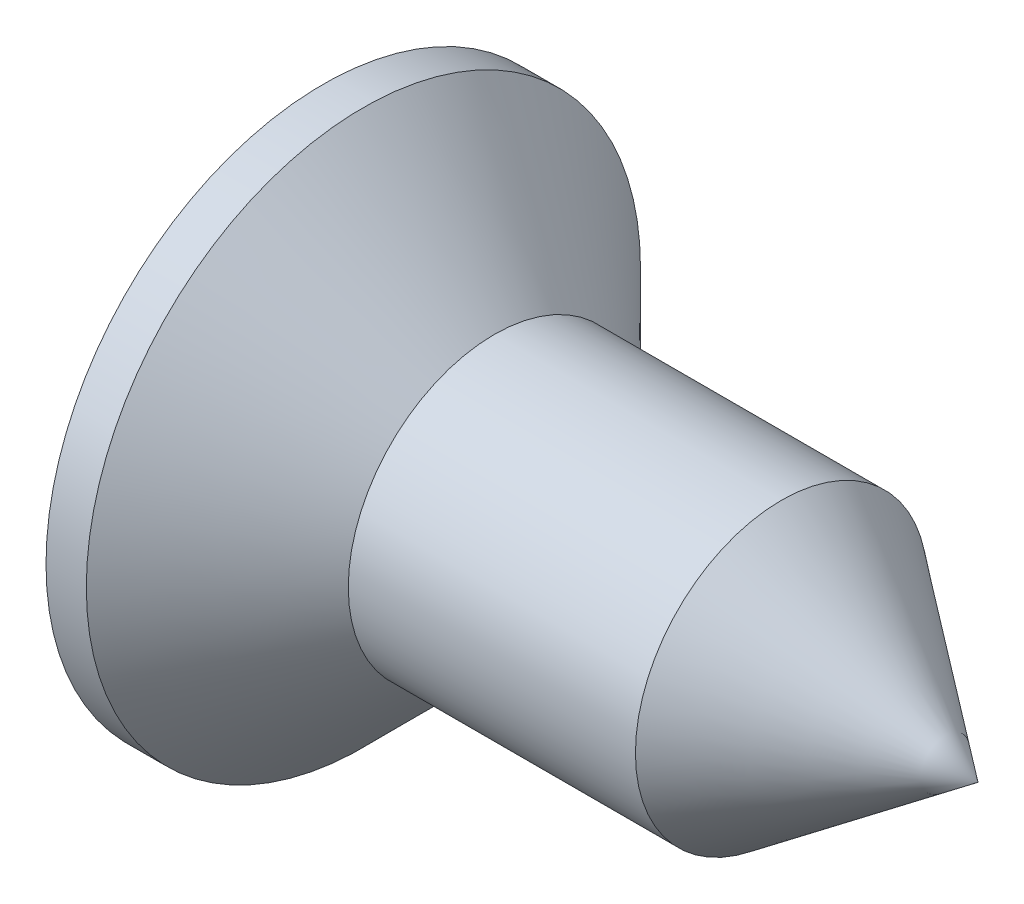
ISO-10303-21;
HEADER;
FILE_DESCRIPTION(('STEP AP214'),'2;1');
FILE_NAME('part.step','',(''),(''),'','','');
FILE_SCHEMA(('AUTOMOTIVE_DESIGN { 1 0 10303 214 1 1 1 1 }'));
ENDSEC;
DATA;
#1=APPLICATION_CONTEXT('core data for automotive mechanical design processes');
#2=APPLICATION_PROTOCOL_DEFINITION('international standard','automotive_design',2000,#1);
#3=PRODUCT_CONTEXT('',#1,'mechanical');
#4=PRODUCT('Part','Part','',(#3));
#5=PRODUCT_RELATED_PRODUCT_CATEGORY('part','',(#4));
#6=PRODUCT_DEFINITION_FORMATION('','',#4);
#7=PRODUCT_DEFINITION_CONTEXT('part definition',#1,'design');
#8=PRODUCT_DEFINITION('design','',#6,#7);
#9=PRODUCT_DEFINITION_SHAPE('','',#8);
#10=(LENGTH_UNIT() NAMED_UNIT(*) SI_UNIT(.MILLI.,.METRE.));
#11=(NAMED_UNIT(*) PLANE_ANGLE_UNIT() SI_UNIT($,.RADIAN.));
#12=(NAMED_UNIT(*) SI_UNIT($,.STERADIAN.) SOLID_ANGLE_UNIT());
#13=UNCERTAINTY_MEASURE_WITH_UNIT(LENGTH_MEASURE(1.E-05),#10,'distance_accuracy_value','');
#14=(GEOMETRIC_REPRESENTATION_CONTEXT(3) GLOBAL_UNCERTAINTY_ASSIGNED_CONTEXT((#13)) GLOBAL_UNIT_ASSIGNED_CONTEXT((#10,
#11,#12)) REPRESENTATION_CONTEXT('',''));
#15=CARTESIAN_POINT('',(0.,0.,0.));
#16=DIRECTION('',(0.,0.,1.));
#17=DIRECTION('',(1.,0.,0.));
#18=AXIS2_PLACEMENT_3D('',#15,#16,#17);
#19=CARTESIAN_POINT('',(0.,0.4,0.4));
#20=DIRECTION('',(-0.139173100960066,-0.99026806874157,0.));
#21=DIRECTION('',(0.99026806874157,-0.139173100960066,0.));
#22=AXIS2_PLACEMENT_3D('',#19,#20,#21);
#23=PLANE('',#22);
#24=DIRECTION('',(-0.980814848463989,0.137844537491629,0.137844537491629));
#25=VECTOR('',#24,1.);
#26=CARTESIAN_POINT('',(1.5,0.189188747946412,0.369438720315922));
#27=LINE('',#26,#25);
#28=CARTESIAN_POINT('',(1.5,0.189188747946412,0.369438720315922));
#29=VERTEX_POINT('',#28);
#30=CARTESIAN_POINT('',(0.,0.400000000000001,0.58024997236951));
#31=VERTEX_POINT('',#30);
#32=EDGE_CURVE('E374',#29,#31,#27,.T.);
#33=ORIENTED_EDGE('',*,*,#32,.F.);
#34=DIRECTION('',(0.,0.,1.));
#35=VECTOR('',#34,1.);
#36=CARTESIAN_POINT('',(1.5,0.189188747946412,0.4));
#37=LINE('',#36,#35);
#38=CARTESIAN_POINT('',(1.5,0.189188747946412,0.549688692685432));
#39=VERTEX_POINT('',#38);
#40=EDGE_CURVE('E214',#39,#29,#37,.F.);
#41=ORIENTED_EDGE('',*,*,#40,.F.);
#42=DIRECTION('',(-0.813777054443472,0.114368906493139,0.569812827943414));
#43=VECTOR('',#42,1.);
#44=CARTESIAN_POINT('',(0.,0.400000000000001,1.6));
#45=LINE('',#44,#43);
#46=CARTESIAN_POINT('',(0.,0.400000000000001,1.6));
#47=VERTEX_POINT('',#46);
#48=EDGE_CURVE('E209',#39,#47,#45,.T.);
#49=ORIENTED_EDGE('',*,*,#48,.T.);
#50=DIRECTION('',(0.,0.,-1.));
#51=VECTOR('',#50,1.);
#52=CARTESIAN_POINT('',(0.,0.4,0.4));
#53=LINE('',#52,#51);
#54=EDGE_CURVE('E294',#47,#31,#53,.T.);
#55=ORIENTED_EDGE('',*,*,#54,.T.);
#56=EDGE_LOOP('',(#33,#41,#49,#55));
#57=FACE_BOUND('',#56,.T.);
#58=ADVANCED_FACE('F90',(#57),#23,.T.);
#59=CARTESIAN_POINT('',(0.,-0.4,0.4));
#60=DIRECTION('',(-0.139173100960066,0.99026806874157,0.));
#61=DIRECTION('',(-0.99026806874157,-0.139173100960066,0.));
#62=AXIS2_PLACEMENT_3D('',#59,#60,#61);
#63=PLANE('',#62);
#64=DIRECTION('',(-0.980814848463989,-0.137844537491629,0.137844537491629));
#65=VECTOR('',#64,1.);
#66=CARTESIAN_POINT('',(0.75,-0.294594373973206,0.474844346342716));
#67=LINE('',#66,#65);
#68=CARTESIAN_POINT('',(1.5,-0.189188747946412,0.369438720315922));
#69=VERTEX_POINT('',#68);
#70=CARTESIAN_POINT('',(0.,-0.4,0.58024997236951));
#71=VERTEX_POINT('',#70);
#72=EDGE_CURVE('E462',#69,#71,#67,.T.);
#73=ORIENTED_EDGE('',*,*,#72,.T.);
#74=DIRECTION('',(0.,0.,1.));
#75=VECTOR('',#74,1.);
#76=CARTESIAN_POINT('',(0.,-0.4,0.4));
#77=LINE('',#76,#75);
#78=CARTESIAN_POINT('',(0.,-0.399999999999999,1.6));
#79=VERTEX_POINT('',#78);
#80=EDGE_CURVE('E205',#71,#79,#77,.T.);
#81=ORIENTED_EDGE('',*,*,#80,.T.);
#82=DIRECTION('',(-0.813777054443472,-0.114368906493139,0.569812827943414));
#83=VECTOR('',#82,1.);
#84=CARTESIAN_POINT('',(0.556440725649475,-0.321797355954818,1.21037600933336));
#85=LINE('',#84,#83);
#86=CARTESIAN_POINT('',(1.5,-0.189188747946412,0.549688692685432));
#87=VERTEX_POINT('',#86);
#88=EDGE_CURVE('E201',#87,#79,#85,.T.);
#89=ORIENTED_EDGE('',*,*,#88,.F.);
#90=DIRECTION('',(0.,0.,-1.));
#91=VECTOR('',#90,1.);
#92=CARTESIAN_POINT('',(1.5,-0.189188747946413,0.4));
#93=LINE('',#92,#91);
#94=EDGE_CURVE('E185',#69,#87,#93,.F.);
#95=ORIENTED_EDGE('',*,*,#94,.F.);
#96=EDGE_LOOP('',(#73,#81,#89,#95));
#97=FACE_BOUND('',#96,.T.);
#98=ADVANCED_FACE('F202',(#97),#63,.T.);
#99=CARTESIAN_POINT('',(0.,-0.4,0.4));
#100=DIRECTION('',(-0.139173100960066,0.,-0.99026806874157));
#101=DIRECTION('',(-0.99026806874157,0.,0.139173100960066));
#102=AXIS2_PLACEMENT_3D('',#99,#100,#101);
#103=PLANE('',#102);
#104=DIRECTION('',(-0.980814848463989,-0.137844537491629,0.137844537491629));
#105=VECTOR('',#104,1.);
#106=CARTESIAN_POINT('',(1.5,-0.369438720315922,0.189188747946412));
#107=LINE('',#106,#105);
#108=CARTESIAN_POINT('',(1.5,-0.369438720315922,0.189188747946413));
#109=VERTEX_POINT('',#108);
#110=CARTESIAN_POINT('',(0.,-0.58024997236951,0.4));
#111=VERTEX_POINT('',#110);
#112=EDGE_CURVE('E464',#109,#111,#107,.T.);
#113=ORIENTED_EDGE('',*,*,#112,.F.);
#114=DIRECTION('',(0.,-1.,0.));
#115=VECTOR('',#114,1.);
#116=CARTESIAN_POINT('',(1.5,-0.4,0.189188747946413));
#117=LINE('',#116,#115);
#118=CARTESIAN_POINT('',(1.5,-0.549688692685432,0.189188747946413));
#119=VERTEX_POINT('',#118);
#120=EDGE_CURVE('E197',#119,#109,#117,.F.);
#121=ORIENTED_EDGE('',*,*,#120,.F.);
#122=DIRECTION('',(-0.813777054443471,-0.569812827943414,0.114368906493139));
#123=VECTOR('',#122,1.);
#124=CARTESIAN_POINT('',(0.0744566334767262,-1.54786490396988,0.389535802582051));
#125=LINE('',#124,#123);
#126=CARTESIAN_POINT('',(0.,-1.6,0.4));
#127=VERTEX_POINT('',#126);
#128=EDGE_CURVE('E179',#119,#127,#125,.T.);
#129=ORIENTED_EDGE('',*,*,#128,.T.);
#130=DIRECTION('',(0.,1.,0.));
#131=VECTOR('',#130,1.);
#132=CARTESIAN_POINT('',(0.,-0.4,0.4));
#133=LINE('',#132,#131);
#134=EDGE_CURVE('E283',#127,#111,#133,.T.);
#135=ORIENTED_EDGE('',*,*,#134,.T.);
#136=EDGE_LOOP('',(#113,#121,#129,#135));
#137=FACE_BOUND('',#136,.T.);
#138=ADVANCED_FACE('F515',(#137),#103,.T.);
#139=CARTESIAN_POINT('',(0.,-0.4,-0.4));
#140=DIRECTION('',(-0.139173100960066,0.,0.99026806874157));
#141=DIRECTION('',(0.99026806874157,0.,0.139173100960066));
#142=AXIS2_PLACEMENT_3D('',#139,#140,#141);
#143=PLANE('',#142);
#144=DIRECTION('',(-0.980814848463989,-0.137844537491629,-0.137844537491629));
#145=VECTOR('',#144,1.);
#146=CARTESIAN_POINT('',(0.75,-0.474844346342716,-0.294594373973206));
#147=LINE('',#146,#145);
#148=CARTESIAN_POINT('',(1.5,-0.369438720315922,-0.189188747946412));
#149=VERTEX_POINT('',#148);
#150=CARTESIAN_POINT('',(0.,-0.58024997236951,-0.4));
#151=VERTEX_POINT('',#150);
#152=EDGE_CURVE('E468',#149,#151,#147,.T.);
#153=ORIENTED_EDGE('',*,*,#152,.T.);
#154=DIRECTION('',(0.,-1.,0.));
#155=VECTOR('',#154,1.);
#156=CARTESIAN_POINT('',(0.,-0.4,-0.4));
#157=LINE('',#156,#155);
#158=CARTESIAN_POINT('',(0.,-1.6,-0.4));
#159=VERTEX_POINT('',#158);
#160=EDGE_CURVE('E279',#151,#159,#157,.T.);
#161=ORIENTED_EDGE('',*,*,#160,.T.);
#162=DIRECTION('',(-0.813777054443471,-0.569812827943414,-0.114368906493139));
#163=VECTOR('',#162,1.);
#164=CARTESIAN_POINT('',(0.556440725649475,-1.21037600933335,-0.321797355954819));
#165=LINE('',#164,#163);
#166=CARTESIAN_POINT('',(1.5,-0.549688692685432,-0.189188747946413));
#167=VERTEX_POINT('',#166);
#168=EDGE_CURVE('E237',#167,#159,#165,.T.);
#169=ORIENTED_EDGE('',*,*,#168,.F.);
#170=DIRECTION('',(0.,1.,0.));
#171=VECTOR('',#170,1.);
#172=CARTESIAN_POINT('',(1.5,-0.4,-0.189188747946413));
#173=LINE('',#172,#171);
#174=EDGE_CURVE('E223',#149,#167,#173,.F.);
#175=ORIENTED_EDGE('',*,*,#174,.F.);
#176=EDGE_LOOP('',(#153,#161,#169,#175));
#177=FACE_BOUND('',#176,.T.);
#178=ADVANCED_FACE('F508',(#177),#143,.T.);
#179=CARTESIAN_POINT('',(0.,-0.4,-0.4));
#180=DIRECTION('',(-0.139173100960066,0.99026806874157,0.));
#181=DIRECTION('',(-0.99026806874157,-0.139173100960066,0.));
#182=AXIS2_PLACEMENT_3D('',#179,#180,#181);
#183=PLANE('',#182);
#184=DIRECTION('',(-0.980814848463989,-0.137844537491629,-0.137844537491629));
#185=VECTOR('',#184,1.);
#186=CARTESIAN_POINT('',(1.5,-0.189188747946412,-0.369438720315922));
#187=LINE('',#186,#185);
#188=CARTESIAN_POINT('',(1.5,-0.189188747946412,-0.369438720315922));
#189=VERTEX_POINT('',#188);
#190=CARTESIAN_POINT('',(0.,-0.4,-0.58024997236951));
#191=VERTEX_POINT('',#190);
#192=EDGE_CURVE('E503',#189,#191,#187,.T.);
#193=ORIENTED_EDGE('',*,*,#192,.F.);
#194=DIRECTION('',(0.,0.,-1.));
#195=VECTOR('',#194,1.);
#196=CARTESIAN_POINT('',(1.5,-0.189188747946413,-0.4));
#197=LINE('',#196,#195);
#198=CARTESIAN_POINT('',(1.5,-0.189188747946412,-0.549688692685432));
#199=VERTEX_POINT('',#198);
#200=EDGE_CURVE('E227',#199,#189,#197,.F.);
#201=ORIENTED_EDGE('',*,*,#200,.F.);
#202=DIRECTION('',(-0.813777054443471,-0.114368906493139,-0.569812827943414));
#203=VECTOR('',#202,1.);
#204=CARTESIAN_POINT('',(0.0744566334767261,-0.389535802582051,-1.54786490396988));
#205=LINE('',#204,#203);
#206=CARTESIAN_POINT('',(0.,-0.4,-1.6));
#207=VERTEX_POINT('',#206);
#208=EDGE_CURVE('E234',#199,#207,#205,.T.);
#209=ORIENTED_EDGE('',*,*,#208,.T.);
#210=DIRECTION('',(0.,0.,1.));
#211=VECTOR('',#210,1.);
#212=CARTESIAN_POINT('',(0.,-0.4,-0.4));
#213=LINE('',#212,#211);
#214=EDGE_CURVE('E272',#207,#191,#213,.T.);
#215=ORIENTED_EDGE('',*,*,#214,.T.);
#216=EDGE_LOOP('',(#193,#201,#209,#215));
#217=FACE_BOUND('',#216,.T.);
#218=ADVANCED_FACE('F523',(#217),#183,.T.);
#219=CARTESIAN_POINT('',(0.,0.4,-0.4));
#220=DIRECTION('',(-0.139173100960066,-0.99026806874157,0.));
#221=DIRECTION('',(0.99026806874157,-0.139173100960066,0.));
#222=AXIS2_PLACEMENT_3D('',#219,#220,#221);
#223=PLANE('',#222);
#224=DIRECTION('',(-0.980814848463989,0.137844537491629,-0.137844537491629));
#225=VECTOR('',#224,1.);
#226=CARTESIAN_POINT('',(0.75,0.294594373973206,-0.474844346342716));
#227=LINE('',#226,#225);
#228=CARTESIAN_POINT('',(1.5,0.189188747946412,-0.369438720315922));
#229=VERTEX_POINT('',#228);
#230=CARTESIAN_POINT('',(0.,0.4,-0.58024997236951));
#231=VERTEX_POINT('',#230);
#232=EDGE_CURVE('E532',#229,#231,#227,.T.);
#233=ORIENTED_EDGE('',*,*,#232,.T.);
#234=DIRECTION('',(0.,0.,-1.));
#235=VECTOR('',#234,1.);
#236=CARTESIAN_POINT('',(0.,0.4,-0.4));
#237=LINE('',#236,#235);
#238=CARTESIAN_POINT('',(0.,0.4,-1.6));
#239=VERTEX_POINT('',#238);
#240=EDGE_CURVE('E261',#231,#239,#237,.T.);
#241=ORIENTED_EDGE('',*,*,#240,.T.);
#242=DIRECTION('',(-0.813777054443471,0.114368906493139,-0.569812827943414));
#243=VECTOR('',#242,1.);
#244=CARTESIAN_POINT('',(0.556440725649475,0.321797355954818,-1.21037600933335));
#245=LINE('',#244,#243);
#246=CARTESIAN_POINT('',(1.5,0.189188747946412,-0.549688692685432));
#247=VERTEX_POINT('',#246);
#248=EDGE_CURVE('E238',#247,#239,#245,.T.);
#249=ORIENTED_EDGE('',*,*,#248,.F.);
#250=DIRECTION('',(0.,0.,1.));
#251=VECTOR('',#250,1.);
#252=CARTESIAN_POINT('',(1.5,0.189188747946412,-0.4));
#253=LINE('',#252,#251);
#254=EDGE_CURVE('E228',#229,#247,#253,.F.);
#255=ORIENTED_EDGE('',*,*,#254,.F.);
#256=EDGE_LOOP('',(#233,#241,#249,#255));
#257=FACE_BOUND('',#256,.T.);
#258=ADVANCED_FACE('F530',(#257),#223,.T.);
#259=CARTESIAN_POINT('',(0.,1.6,-0.4));
#260=DIRECTION('',(-0.139173100960066,0.,0.99026806874157));
#261=DIRECTION('',(0.99026806874157,0.,0.139173100960066));
#262=AXIS2_PLACEMENT_3D('',#259,#260,#261);
#263=PLANE('',#262);
#264=DIRECTION('',(-0.980814848463989,0.137844537491629,-0.137844537491629));
#265=VECTOR('',#264,1.);
#266=CARTESIAN_POINT('',(1.5,0.369438720315922,-0.189188747946413));
#267=LINE('',#266,#265);
#268=CARTESIAN_POINT('',(1.5,0.369438720315922,-0.189188747946413));
#269=VERTEX_POINT('',#268);
#270=CARTESIAN_POINT('',(0.,0.58024997236951,-0.4));
#271=VERTEX_POINT('',#270);
#272=EDGE_CURVE('E533',#269,#271,#267,.T.);
#273=ORIENTED_EDGE('',*,*,#272,.F.);
#274=DIRECTION('',(0.,1.,0.));
#275=VECTOR('',#274,1.);
#276=CARTESIAN_POINT('',(1.5,1.6,-0.189188747946412));
#277=LINE('',#276,#275);
#278=CARTESIAN_POINT('',(1.5,0.549688692685432,-0.189188747946412));
#279=VERTEX_POINT('',#278);
#280=EDGE_CURVE('E232',#279,#269,#277,.F.);
#281=ORIENTED_EDGE('',*,*,#280,.F.);
#282=DIRECTION('',(-0.813777054443471,0.569812827943414,-0.114368906493139));
#283=VECTOR('',#282,1.);
#284=CARTESIAN_POINT('',(0.,1.6,-0.4));
#285=LINE('',#284,#283);
#286=CARTESIAN_POINT('',(0.,1.6,-0.4));
#287=VERTEX_POINT('',#286);
#288=EDGE_CURVE('E244',#279,#287,#285,.T.);
#289=ORIENTED_EDGE('',*,*,#288,.T.);
#290=DIRECTION('',(0.,-1.,0.));
#291=VECTOR('',#290,1.);
#292=CARTESIAN_POINT('',(0.,1.6,-0.4));
#293=LINE('',#292,#291);
#294=EDGE_CURVE('E257',#287,#271,#293,.T.);
#295=ORIENTED_EDGE('',*,*,#294,.T.);
#296=EDGE_LOOP('',(#273,#281,#289,#295));
#297=FACE_BOUND('',#296,.T.);
#298=ADVANCED_FACE('F92',(#297),#263,.T.);
#299=CARTESIAN_POINT('',(6.62068469401335,0.,0.));
#300=DIRECTION('',(1.,0.,0.));
#301=DIRECTION('',(0.,0.,-1.));
#302=AXIS2_PLACEMENT_3D('',#299,#300,#301);
#303=CYLINDRICAL_SURFACE('',#302,1.45);
#304=CARTESIAN_POINT('',(1.7,0.,0.));
#305=DIRECTION('',(1.,0.,0.));
#306=DIRECTION('',(0.,0.,-1.));
#307=AXIS2_PLACEMENT_3D('',#304,#305,#306);
#308=CIRCLE('',#307,1.45);
#309=CARTESIAN_POINT('',(1.7,0.,-1.45));
#310=VERTEX_POINT('',#309);
#311=EDGE_CURVE('E589',#310,#310,#308,.T.);
#312=ORIENTED_EDGE('',*,*,#311,.T.);
#313=EDGE_LOOP('',(#312));
#314=FACE_BOUND('',#313,.T.);
#315=CARTESIAN_POINT('',(4.55,0.,0.));
#316=DIRECTION('',(-1.,0.,0.));
#317=DIRECTION('',(0.,0.,1.));
#318=AXIS2_PLACEMENT_3D('',#315,#316,#317);
#319=CIRCLE('',#318,1.45);
#320=CARTESIAN_POINT('',(4.55,0.,1.45));
#321=VERTEX_POINT('',#320);
#322=EDGE_CURVE('E254',#321,#321,#319,.T.);
#323=ORIENTED_EDGE('',*,*,#322,.T.);
#324=EDGE_LOOP('',(#323));
#325=FACE_BOUND('',#324,.T.);
#326=ADVANCED_FACE('F327',(#314,#325),#303,.T.);
#327=CARTESIAN_POINT('',(0.,0.,0.));
#328=DIRECTION('',(-1.,0.,0.));
#329=DIRECTION('',(0.,0.,1.));
#330=AXIS2_PLACEMENT_3D('',#327,#328,#329);
#331=PLANE('',#330);
#332=CARTESIAN_POINT('',(0.,0.58024997236951,0.58024997236951));
#333=DIRECTION('',(1.,0.,0.));
#334=DIRECTION('',(0.,0.,1.));
#335=AXIS2_PLACEMENT_3D('',#332,#333,#334);
#336=CIRCLE('',#335,0.18024997236951);
#337=CARTESIAN_POINT('',(0.,0.58024997236951,0.4));
#338=VERTEX_POINT('',#337);
#339=EDGE_CURVE('E364',#31,#338,#336,.T.);
#340=ORIENTED_EDGE('',*,*,#339,.F.);
#341=ORIENTED_EDGE('',*,*,#54,.F.);
#342=DIRECTION('',(0.,1.,0.));
#343=VECTOR('',#342,1.);
#344=CARTESIAN_POINT('',(0.,0.400000000000001,1.6));
#345=LINE('',#344,#343);
#346=EDGE_CURVE('E292',#79,#47,#345,.T.);
#347=ORIENTED_EDGE('',*,*,#346,.F.);
#348=ORIENTED_EDGE('',*,*,#80,.F.);
#349=CARTESIAN_POINT('',(0.,-0.58024997236951,0.58024997236951));
#350=DIRECTION('',(1.,0.,0.));
#351=DIRECTION('',(0.,0.,1.));
#352=AXIS2_PLACEMENT_3D('',#349,#350,#351);
#353=CIRCLE('',#352,0.18024997236951);
#354=EDGE_CURVE('E309',#111,#71,#353,.T.);
#355=ORIENTED_EDGE('',*,*,#354,.F.);
#356=ORIENTED_EDGE('',*,*,#134,.F.);
#357=DIRECTION('',(0.,0.,1.));
#358=VECTOR('',#357,1.);
#359=CARTESIAN_POINT('',(0.,-1.6,-0.4));
#360=LINE('',#359,#358);
#361=EDGE_CURVE('E282',#159,#127,#360,.T.);
#362=ORIENTED_EDGE('',*,*,#361,.F.);
#363=ORIENTED_EDGE('',*,*,#160,.F.);
#364=CARTESIAN_POINT('',(0.,-0.58024997236951,-0.58024997236951));
#365=DIRECTION('',(1.,0.,0.));
#366=DIRECTION('',(0.,0.,-1.));
#367=AXIS2_PLACEMENT_3D('',#364,#365,#366);
#368=CIRCLE('',#367,0.18024997236951);
#369=EDGE_CURVE('E456',#191,#151,#368,.T.);
#370=ORIENTED_EDGE('',*,*,#369,.F.);
#371=ORIENTED_EDGE('',*,*,#214,.F.);
#372=DIRECTION('',(0.,-1.,0.));
#373=VECTOR('',#372,1.);
#374=CARTESIAN_POINT('',(0.,0.4,-1.6));
#375=LINE('',#374,#373);
#376=EDGE_CURVE('E269',#239,#207,#375,.T.);
#377=ORIENTED_EDGE('',*,*,#376,.F.);
#378=ORIENTED_EDGE('',*,*,#240,.F.);
#379=CARTESIAN_POINT('',(0.,0.58024997236951,-0.58024997236951));
#380=DIRECTION('',(1.,0.,0.));
#381=DIRECTION('',(0.,0.,-1.));
#382=AXIS2_PLACEMENT_3D('',#379,#380,#381);
#383=CIRCLE('',#382,0.18024997236951);
#384=EDGE_CURVE('E352',#271,#231,#383,.T.);
#385=ORIENTED_EDGE('',*,*,#384,.F.);
#386=ORIENTED_EDGE('',*,*,#294,.F.);
#387=DIRECTION('',(0.,0.,-1.));
#388=VECTOR('',#387,1.);
#389=CARTESIAN_POINT('',(0.,1.6,-0.4));
#390=LINE('',#389,#388);
#391=CARTESIAN_POINT('',(0.,1.6,0.4));
#392=VERTEX_POINT('',#391);
#393=EDGE_CURVE('E150',#392,#287,#390,.T.);
#394=ORIENTED_EDGE('',*,*,#393,.F.);
#395=DIRECTION('',(0.,1.,0.));
#396=VECTOR('',#395,1.);
#397=CARTESIAN_POINT('',(0.,1.6,0.4));
#398=LINE('',#397,#396);
#399=EDGE_CURVE('E233',#338,#392,#398,.T.);
#400=ORIENTED_EDGE('',*,*,#399,.F.);
#401=EDGE_LOOP('',(#340,#341,#347,#348,#355,#356,#362,#363,#370,#371,#377,#378,#385,#386,#394,#400));
#402=FACE_BOUND('',#401,.T.);
#403=CARTESIAN_POINT('',(0.,0.,0.));
#404=DIRECTION('',(1.,0.,0.));
#405=DIRECTION('',(0.,0.,-1.));
#406=AXIS2_PLACEMENT_3D('',#403,#404,#405);
#407=CIRCLE('',#406,2.75);
#408=CARTESIAN_POINT('',(0.,0.,-2.75));
#409=VERTEX_POINT('',#408);
#410=EDGE_CURVE('E12',#409,#409,#407,.T.);
#411=ORIENTED_EDGE('',*,*,#410,.F.);
#412=EDGE_LOOP('',(#411));
#413=FACE_BOUND('',#412,.T.);
#414=ADVANCED_FACE('F316',(#402,#413),#331,.T.);
#415=CARTESIAN_POINT('',(6.62068469401335,0.,0.));
#416=DIRECTION('',(1.,0.,0.));
#417=DIRECTION('',(0.,0.,-1.));
#418=AXIS2_PLACEMENT_3D('',#415,#416,#417);
#419=CYLINDRICAL_SURFACE('',#418,2.75);
#420=ORIENTED_EDGE('',*,*,#410,.T.);
#421=EDGE_LOOP('',(#420));
#422=FACE_BOUND('',#421,.T.);
#423=CARTESIAN_POINT('',(0.399999999999965,0.,0.));
#424=DIRECTION('',(1.,0.,0.));
#425=DIRECTION('',(0.,0.,-1.));
#426=AXIS2_PLACEMENT_3D('',#423,#424,#425);
#427=CIRCLE('',#426,2.75);
#428=CARTESIAN_POINT('',(0.399999999999965,0.,-2.75));
#429=VERTEX_POINT('',#428);
#430=EDGE_CURVE('E106',#429,#429,#427,.T.);
#431=ORIENTED_EDGE('',*,*,#430,.F.);
#432=EDGE_LOOP('',(#431));
#433=FACE_BOUND('',#432,.T.);
#434=ADVANCED_FACE('F326',(#422,#433),#419,.T.);
#435=CARTESIAN_POINT('',(1.7,0.,0.));
#436=DIRECTION('',(-1.,0.,0.));
#437=DIRECTION('',(0.,0.,1.));
#438=AXIS2_PLACEMENT_3D('',#435,#436,#437);
#439=CONICAL_SURFACE('',#438,1.45,0.785398163397435);
#440=ORIENTED_EDGE('',*,*,#430,.T.);
#441=EDGE_LOOP('',(#440));
#442=FACE_BOUND('',#441,.T.);
#443=ORIENTED_EDGE('',*,*,#311,.F.);
#444=EDGE_LOOP('',(#443));
#445=FACE_BOUND('',#444,.T.);
#446=ADVANCED_FACE('F579',(#442,#445),#439,.T.);
#447=CARTESIAN_POINT('',(4.55,0.,0.));
#448=DIRECTION('',(-1.,0.,0.));
#449=DIRECTION('',(0.,0.,1.));
#450=AXIS2_PLACEMENT_3D('',#447,#448,#449);
#451=CONICAL_SURFACE('',#450,1.45,0.639385905686173);
#452=CARTESIAN_POINT('',(6.5,0.,0.));
#453=VERTEX_POINT('',#452);
#454=VERTEX_LOOP('',#453);
#455=FACE_BOUND('',#454,.T.);
#456=ORIENTED_EDGE('',*,*,#322,.F.);
#457=EDGE_LOOP('',(#456));
#458=FACE_BOUND('',#457,.T.);
#459=ADVANCED_FACE('F415',(#455,#458),#451,.T.);
#460=CARTESIAN_POINT('',(0.,1.6,-0.4));
#461=DIRECTION('',(-0.573576436351047,-0.819152044288991,0.));
#462=DIRECTION('',(0.819152044288991,-0.573576436351047,0.));
#463=AXIS2_PLACEMENT_3D('',#460,#461,#462);
#464=PLANE('',#463);
#465=ORIENTED_EDGE('',*,*,#393,.T.);
#466=ORIENTED_EDGE('',*,*,#288,.F.);
#467=DIRECTION('',(0.,0.,1.));
#468=VECTOR('',#467,1.);
#469=CARTESIAN_POINT('',(1.5,0.549688692685432,-0.4));
#470=LINE('',#469,#468);
#471=CARTESIAN_POINT('',(1.5,0.549688692685432,0.189188747946412));
#472=VERTEX_POINT('',#471);
#473=EDGE_CURVE('E229',#472,#279,#470,.F.);
#474=ORIENTED_EDGE('',*,*,#473,.F.);
#475=DIRECTION('',(-0.813777054443471,0.569812827943414,0.114368906493139));
#476=VECTOR('',#475,1.);
#477=CARTESIAN_POINT('',(0.,1.6,0.4));
#478=LINE('',#477,#476);
#479=EDGE_CURVE('E250',#472,#392,#478,.T.);
#480=ORIENTED_EDGE('',*,*,#479,.T.);
#481=EDGE_LOOP('',(#465,#466,#474,#480));
#482=FACE_BOUND('',#481,.T.);
#483=ADVANCED_FACE('F387',(#482),#464,.T.);
#484=CARTESIAN_POINT('',(0.,1.6,0.4));
#485=DIRECTION('',(-0.139173100960066,0.,-0.99026806874157));
#486=DIRECTION('',(-0.99026806874157,0.,0.139173100960066));
#487=AXIS2_PLACEMENT_3D('',#484,#485,#486);
#488=PLANE('',#487);
#489=DIRECTION('',(0.,-1.,0.));
#490=VECTOR('',#489,1.);
#491=CARTESIAN_POINT('',(1.5,1.6,0.189188747946412));
#492=LINE('',#491,#490);
#493=CARTESIAN_POINT('',(1.5,0.369438720315922,0.189188747946413));
#494=VERTEX_POINT('',#493);
#495=EDGE_CURVE('E216',#494,#472,#492,.F.);
#496=ORIENTED_EDGE('',*,*,#495,.F.);
#497=DIRECTION('',(-0.980814848463989,0.137844537491629,0.137844537491629));
#498=VECTOR('',#497,1.);
#499=CARTESIAN_POINT('',(1.5,0.369438720315922,0.189188747946412));
#500=LINE('',#499,#498);
#501=EDGE_CURVE('E386',#494,#338,#500,.T.);
#502=ORIENTED_EDGE('',*,*,#501,.T.);
#503=ORIENTED_EDGE('',*,*,#399,.T.);
#504=ORIENTED_EDGE('',*,*,#479,.F.);
#505=EDGE_LOOP('',(#496,#502,#503,#504));
#506=FACE_BOUND('',#505,.T.);
#507=ADVANCED_FACE('F384',(#506),#488,.T.);
#508=CARTESIAN_POINT('',(0.,0.400000000000001,1.6));
#509=DIRECTION('',(-0.573576436351047,0.,-0.819152044288991));
#510=DIRECTION('',(-0.819152044288991,0.,0.573576436351047));
#511=AXIS2_PLACEMENT_3D('',#508,#509,#510);
#512=PLANE('',#511);
#513=ORIENTED_EDGE('',*,*,#346,.T.);
#514=ORIENTED_EDGE('',*,*,#48,.F.);
#515=DIRECTION('',(0.,-1.,0.));
#516=VECTOR('',#515,1.);
#517=CARTESIAN_POINT('',(1.5,0.4,0.549688692685432));
#518=LINE('',#517,#516);
#519=EDGE_CURVE('E191',#87,#39,#518,.F.);
#520=ORIENTED_EDGE('',*,*,#519,.F.);
#521=ORIENTED_EDGE('',*,*,#88,.T.);
#522=EDGE_LOOP('',(#513,#514,#520,#521));
#523=FACE_BOUND('',#522,.T.);
#524=ADVANCED_FACE('F211',(#523),#512,.T.);
#525=CARTESIAN_POINT('',(0.,-1.6,-0.4));
#526=DIRECTION('',(-0.573576436351047,0.819152044288991,0.));
#527=DIRECTION('',(-0.819152044288991,-0.573576436351047,0.));
#528=AXIS2_PLACEMENT_3D('',#525,#526,#527);
#529=PLANE('',#528);
#530=ORIENTED_EDGE('',*,*,#361,.T.);
#531=ORIENTED_EDGE('',*,*,#128,.F.);
#532=DIRECTION('',(0.,0.,-1.));
#533=VECTOR('',#532,1.);
#534=CARTESIAN_POINT('',(1.5,-0.549688692685432,-0.4));
#535=LINE('',#534,#533);
#536=EDGE_CURVE('E220',#167,#119,#535,.F.);
#537=ORIENTED_EDGE('',*,*,#536,.F.);
#538=ORIENTED_EDGE('',*,*,#168,.T.);
#539=EDGE_LOOP('',(#530,#531,#537,#538));
#540=FACE_BOUND('',#539,.T.);
#541=ADVANCED_FACE('F513',(#540),#529,.T.);
#542=CARTESIAN_POINT('',(0.,0.4,-1.6));
#543=DIRECTION('',(-0.573576436351047,0.,0.819152044288991));
#544=DIRECTION('',(0.819152044288991,0.,0.573576436351047));
#545=AXIS2_PLACEMENT_3D('',#542,#543,#544);
#546=PLANE('',#545);
#547=ORIENTED_EDGE('',*,*,#376,.T.);
#548=ORIENTED_EDGE('',*,*,#208,.F.);
#549=DIRECTION('',(0.,1.,0.));
#550=VECTOR('',#549,1.);
#551=CARTESIAN_POINT('',(1.5,0.4,-0.549688692685432));
#552=LINE('',#551,#550);
#553=EDGE_CURVE('E224',#247,#199,#552,.F.);
#554=ORIENTED_EDGE('',*,*,#553,.F.);
#555=ORIENTED_EDGE('',*,*,#248,.T.);
#556=EDGE_LOOP('',(#547,#548,#554,#555));
#557=FACE_BOUND('',#556,.T.);
#558=ADVANCED_FACE('F410',(#557),#546,.T.);
#559=CARTESIAN_POINT('',(1.5,1.6,-1.6));
#560=DIRECTION('',(1.,0.,0.));
#561=DIRECTION('',(0.,0.,-1.));
#562=AXIS2_PLACEMENT_3D('',#559,#560,#561);
#563=PLANE('',#562);
#564=ORIENTED_EDGE('',*,*,#280,.T.);
#565=CARTESIAN_POINT('',(1.5,0.369438720315922,-0.189188747946413));
#566=CARTESIAN_POINT('',(1.5,0.359220610012964,-0.189225402485596));
#567=CARTESIAN_POINT('',(1.5,0.349034175872229,-0.190201131059475));
#568=CARTESIAN_POINT('',(1.5,0.328928914532991,-0.193853448329299));
#569=CARTESIAN_POINT('',(1.5,0.319011183329768,-0.196536150427581));
#570=CARTESIAN_POINT('',(1.5,0.299760945318756,-0.20340927530374));
#571=CARTESIAN_POINT('',(1.5,0.290426377142429,-0.207593987720541));
#572=CARTESIAN_POINT('',(1.5,0.272568217801818,-0.217415031257747));
#573=CARTESIAN_POINT('',(1.5,0.264043102878911,-0.223048557772766));
#574=CARTESIAN_POINT('',(1.5,0.247913473355341,-0.235919978454973));
#575=CARTESIAN_POINT('',(1.5,0.240339557670754,-0.243196637625807));
#576=CARTESIAN_POINT('',(1.5,0.226680901214941,-0.259042239438757));
#577=CARTESIAN_POINT('',(1.5,0.220597985035261,-0.267612744898506));
#578=CARTESIAN_POINT('',(1.5,0.210383086421738,-0.284928303345146));
#579=CARTESIAN_POINT('',(1.5,0.206134939741649,-0.293606072436436));
#580=CARTESIAN_POINT('',(1.5,0.198981511068322,-0.311490424530438));
#581=CARTESIAN_POINT('',(1.5,0.196074733020649,-0.320696405455551));
#582=CARTESIAN_POINT('',(1.5,0.192374075531407,-0.33652030664861));
#583=CARTESIAN_POINT('',(1.5,0.191204125302345,-0.343051608385876));
#584=CARTESIAN_POINT('',(1.5,0.189615846859015,-0.356197776939487));
#585=CARTESIAN_POINT('',(1.5,0.189196842108472,-0.36281256312665));
#586=CARTESIAN_POINT('',(1.5,0.189188747946412,-0.369438720315922));
#587=B_SPLINE_CURVE_WITH_KNOTS('',3,(#565,#566,#567,#568,#569,#570,#571,#572,#573,#574,#575,
#576,#577,#578,#579,#580,#581,#582,#583,#584,#585,#586),.UNSPECIFIED.,.F.,.F.,(4,2,2,2,2,2,2,2,
2,2,4),(0.,0.0305708644920424,0.0612518373629996,0.0918173814149311,0.122324196493565,
0.153644244247748,0.185002430272475,0.213883194137834,0.242731668408638,0.262598222825706,
0.2824468701986),.UNSPECIFIED.);
#588=EDGE_CURVE('E94',#269,#229,#587,.T.);
#589=ORIENTED_EDGE('',*,*,#588,.T.);
#590=ORIENTED_EDGE('',*,*,#254,.T.);
#591=ORIENTED_EDGE('',*,*,#553,.T.);
#592=ORIENTED_EDGE('',*,*,#200,.T.);
#593=CARTESIAN_POINT('',(1.5,-0.189188747946412,-0.369438720315922));
#594=CARTESIAN_POINT('',(1.5,-0.189225402485596,-0.359220610012964));
#595=CARTESIAN_POINT('',(1.5,-0.190201131059475,-0.349034175872229));
#596=CARTESIAN_POINT('',(1.5,-0.193853448329299,-0.328928914532992));
#597=CARTESIAN_POINT('',(1.5,-0.19653615042758,-0.319011183329769));
#598=CARTESIAN_POINT('',(1.5,-0.20340927530374,-0.299760945318757));
#599=CARTESIAN_POINT('',(1.5,-0.207593987720541,-0.29042637714243));
#600=CARTESIAN_POINT('',(1.5,-0.217415031257747,-0.272568217801819));
#601=CARTESIAN_POINT('',(1.5,-0.223048557772765,-0.264043102878912));
#602=CARTESIAN_POINT('',(1.5,-0.235919978454973,-0.247913473355342));
#603=CARTESIAN_POINT('',(1.5,-0.243196637625806,-0.240339557670755));
#604=CARTESIAN_POINT('',(1.5,-0.259042239438756,-0.226680901214942));
#605=CARTESIAN_POINT('',(1.5,-0.267612744898505,-0.220597985035262));
#606=CARTESIAN_POINT('',(1.5,-0.284928303345145,-0.210383086421738));
#607=CARTESIAN_POINT('',(1.5,-0.293606072436435,-0.206134939741649));
#608=CARTESIAN_POINT('',(1.5,-0.311490424530437,-0.198981511068323));
#609=CARTESIAN_POINT('',(1.5,-0.32069640545555,-0.196074733020649));
#610=CARTESIAN_POINT('',(1.5,-0.33652030664861,-0.192374075531407));
#611=CARTESIAN_POINT('',(1.5,-0.343051608385875,-0.191204125302346));
#612=CARTESIAN_POINT('',(1.5,-0.356197776939487,-0.189615846859015));
#613=CARTESIAN_POINT('',(1.5,-0.36281256312665,-0.189196842108472));
#614=CARTESIAN_POINT('',(1.5,-0.369438720315922,-0.189188747946412));
#615=B_SPLINE_CURVE_WITH_KNOTS('',3,(#593,#594,#595,#596,#597,#598,#599,#600,#601,#602,#603,
#604,#605,#606,#607,#608,#609,#610,#611,#612,#613,#614),.UNSPECIFIED.,.F.,.F.,(4,2,2,2,2,2,2,2,
2,2,4),(0.,0.0305708644920422,0.0612518373629992,0.0918173814149305,0.122324196493565,
0.153644244247747,0.185002430272473,0.213883194137834,0.242731668408637,0.262598222825706,
0.2824468701986),.UNSPECIFIED.);
#616=EDGE_CURVE('E388',#189,#149,#615,.T.);
#617=ORIENTED_EDGE('',*,*,#616,.T.);
#618=ORIENTED_EDGE('',*,*,#174,.T.);
#619=ORIENTED_EDGE('',*,*,#536,.T.);
#620=ORIENTED_EDGE('',*,*,#120,.T.);
#621=CARTESIAN_POINT('',(1.5,-0.369438720315922,0.189188747946412));
#622=CARTESIAN_POINT('',(1.5,-0.359220610012964,0.189225402485596));
#623=CARTESIAN_POINT('',(1.5,-0.349034175872229,0.190201131059475));
#624=CARTESIAN_POINT('',(1.5,-0.328928914532991,0.193853448329299));
#625=CARTESIAN_POINT('',(1.5,-0.319011183329768,0.19653615042758));
#626=CARTESIAN_POINT('',(1.5,-0.299760945318756,0.20340927530374));
#627=CARTESIAN_POINT('',(1.5,-0.29042637714243,0.207593987720541));
#628=CARTESIAN_POINT('',(1.5,-0.272568217801819,0.217415031257747));
#629=CARTESIAN_POINT('',(1.5,-0.264043102878911,0.223048557772765));
#630=CARTESIAN_POINT('',(1.5,-0.247913473355341,0.235919978454973));
#631=CARTESIAN_POINT('',(1.5,-0.240339557670755,0.243196637625806));
#632=CARTESIAN_POINT('',(1.5,-0.226680901214942,0.259042239438756));
#633=CARTESIAN_POINT('',(1.5,-0.220597985035261,0.267612744898505));
#634=CARTESIAN_POINT('',(1.5,-0.210383086421738,0.284928303345145));
#635=CARTESIAN_POINT('',(1.5,-0.206134939741649,0.293606072436435));
#636=CARTESIAN_POINT('',(1.5,-0.198981511068323,0.311490424530437));
#637=CARTESIAN_POINT('',(1.5,-0.196074733020649,0.32069640545555));
#638=CARTESIAN_POINT('',(1.5,-0.192374075531407,0.336520306648609));
#639=CARTESIAN_POINT('',(1.5,-0.191204125302346,0.343051608385875));
#640=CARTESIAN_POINT('',(1.5,-0.189615846859015,0.356197776939487));
#641=CARTESIAN_POINT('',(1.5,-0.189196842108472,0.36281256312665));
#642=CARTESIAN_POINT('',(1.5,-0.189188747946412,0.369438720315922));
#643=B_SPLINE_CURVE_WITH_KNOTS('',3,(#621,#622,#623,#624,#625,#626,#627,#628,#629,#630,#631,
#632,#633,#634,#635,#636,#637,#638,#639,#640,#641,#642),.UNSPECIFIED.,.F.,.F.,(4,2,2,2,2,2,2,2,
2,2,4),(0.,0.0305708644920422,0.0612518373629992,0.0918173814149307,0.122324196493565,
0.153644244247747,0.185002430272473,0.213883194137833,0.242731668408636,0.262598222825706,
0.282446870198599),.UNSPECIFIED.);
#644=EDGE_CURVE('E193',#109,#69,#643,.T.);
#645=ORIENTED_EDGE('',*,*,#644,.T.);
#646=ORIENTED_EDGE('',*,*,#94,.T.);
#647=ORIENTED_EDGE('',*,*,#519,.T.);
#648=ORIENTED_EDGE('',*,*,#40,.T.);
#649=CARTESIAN_POINT('',(1.5,0.189188747946412,0.369438720315922));
#650=CARTESIAN_POINT('',(1.5,0.189225402485596,0.359220610012964));
#651=CARTESIAN_POINT('',(1.5,0.190201131059475,0.349034175872229));
#652=CARTESIAN_POINT('',(1.5,0.193853448329299,0.328928914532991));
#653=CARTESIAN_POINT('',(1.5,0.19653615042758,0.319011183329769));
#654=CARTESIAN_POINT('',(1.5,0.20340927530374,0.299760945318756));
#655=CARTESIAN_POINT('',(1.5,0.207593987720541,0.29042637714243));
#656=CARTESIAN_POINT('',(1.5,0.217415031257747,0.272568217801819));
#657=CARTESIAN_POINT('',(1.5,0.223048557772765,0.264043102878912));
#658=CARTESIAN_POINT('',(1.5,0.235919978454973,0.247913473355342));
#659=CARTESIAN_POINT('',(1.5,0.243196637625806,0.240339557670755));
#660=CARTESIAN_POINT('',(1.5,0.259042239438756,0.226680901214942));
#661=CARTESIAN_POINT('',(1.5,0.267612744898506,0.220597985035262));
#662=CARTESIAN_POINT('',(1.5,0.284928303345145,0.210383086421738));
#663=CARTESIAN_POINT('',(1.5,0.293606072436435,0.206134939741649));
#664=CARTESIAN_POINT('',(1.5,0.311490424530437,0.198981511068323));
#665=CARTESIAN_POINT('',(1.5,0.32069640545555,0.19607473302065));
#666=CARTESIAN_POINT('',(1.5,0.336520306648609,0.192374075531407));
#667=CARTESIAN_POINT('',(1.5,0.343051608385875,0.191204125302346));
#668=CARTESIAN_POINT('',(1.5,0.356197776939487,0.189615846859015));
#669=CARTESIAN_POINT('',(1.5,0.36281256312665,0.189196842108472));
#670=CARTESIAN_POINT('',(1.5,0.369438720315922,0.189188747946413));
#671=B_SPLINE_CURVE_WITH_KNOTS('',3,(#649,#650,#651,#652,#653,#654,#655,#656,#657,#658,#659,
#660,#661,#662,#663,#664,#665,#666,#667,#668,#669,#670),.UNSPECIFIED.,.F.,.F.,(4,2,2,2,2,2,2,2,
2,2,4),(0.,0.0305708644920422,0.0612518373629993,0.0918173814149307,0.122324196493565,
0.153644244247747,0.185002430272474,0.213883194137834,0.242731668408636,0.262598222825706,
0.282446870198599),.UNSPECIFIED.);
#672=EDGE_CURVE('E115',#29,#494,#671,.T.);
#673=ORIENTED_EDGE('',*,*,#672,.T.);
#674=ORIENTED_EDGE('',*,*,#495,.T.);
#675=ORIENTED_EDGE('',*,*,#473,.T.);
#676=EDGE_LOOP('',(#564,#589,#590,#591,#592,#617,#618,#619,#620,#645,#646,#647,#648,#673,#674,#675));
#677=FACE_BOUND('',#676,.T.);
#678=ADVANCED_FACE('F188',(#677),#563,.F.);
#679=CARTESIAN_POINT('',(1.5,0.369438720315922,-0.189188747946413));
#680=CARTESIAN_POINT('',(0.,0.58024997236951,-0.4));
#681=CARTESIAN_POINT('',(1.5,0.326953394392199,-0.189188747946413));
#682=CARTESIAN_POINT('',(0.,0.537764646445788,-0.4));
#683=CARTESIAN_POINT('',(1.5,0.277178738943648,-0.20678674614586));
#684=CARTESIAN_POINT('',(0.,0.487989990997236,-0.417597998199447));
#685=CARTESIAN_POINT('',(1.5,0.206786746145859,-0.277178738943648));
#686=CARTESIAN_POINT('',(0.,0.417597998199448,-0.487989990997236));
#687=CARTESIAN_POINT('',(1.5,0.189188747946412,-0.3269533943922));
#688=CARTESIAN_POINT('',(0.,0.4,-0.537764646445787));
#689=CARTESIAN_POINT('',(1.5,0.189188747946412,-0.369438720315922));
#690=CARTESIAN_POINT('',(0.,0.4,-0.58024997236951));
#691=B_SPLINE_SURFACE_WITH_KNOTS('',3,1,((#679,#680),(#681,#682),(#683,#684),(#685,#686),(#687,
#688),(#689,#690)),.UNSPECIFIED.,.F.,.F.,.F.,(4,2,4),(2,2),(0.,0.5,1.),(0.,1.),.UNSPECIFIED.);
#692=ORIENTED_EDGE('',*,*,#588,.F.);
#693=ORIENTED_EDGE('',*,*,#272,.T.);
#694=ORIENTED_EDGE('',*,*,#384,.T.);
#695=ORIENTED_EDGE('',*,*,#232,.F.);
#696=EDGE_LOOP('',(#692,#693,#694,#695));
#697=FACE_BOUND('',#696,.T.);
#698=ADVANCED_FACE('F409',(#697),#691,.F.);
#699=CARTESIAN_POINT('',(1.5,-0.189188747946412,-0.369438720315922));
#700=CARTESIAN_POINT('',(0.,-0.4,-0.58024997236951));
#701=CARTESIAN_POINT('',(1.5,-0.189188747946412,-0.3269533943922));
#702=CARTESIAN_POINT('',(0.,-0.4,-0.537764646445787));
#703=CARTESIAN_POINT('',(1.5,-0.20678674614586,-0.277178738943648));
#704=CARTESIAN_POINT('',(0.,-0.417597998199448,-0.487989990997236));
#705=CARTESIAN_POINT('',(1.5,-0.277178738943648,-0.20678674614586));
#706=CARTESIAN_POINT('',(0.,-0.487989990997236,-0.417597998199447));
#707=CARTESIAN_POINT('',(1.5,-0.3269533943922,-0.189188747946412));
#708=CARTESIAN_POINT('',(0.,-0.537764646445787,-0.4));
#709=CARTESIAN_POINT('',(1.5,-0.369438720315922,-0.189188747946412));
#710=CARTESIAN_POINT('',(0.,-0.58024997236951,-0.4));
#711=B_SPLINE_SURFACE_WITH_KNOTS('',3,1,((#699,#700),(#701,#702),(#703,#704),(#705,#706),(#707,
#708),(#709,#710)),.UNSPECIFIED.,.F.,.F.,.F.,(4,2,4),(2,2),(0.,0.5,1.),(0.,1.),.UNSPECIFIED.);
#712=ORIENTED_EDGE('',*,*,#616,.F.);
#713=ORIENTED_EDGE('',*,*,#192,.T.);
#714=ORIENTED_EDGE('',*,*,#369,.T.);
#715=ORIENTED_EDGE('',*,*,#152,.F.);
#716=EDGE_LOOP('',(#712,#713,#714,#715));
#717=FACE_BOUND('',#716,.T.);
#718=ADVANCED_FACE('F402',(#717),#711,.F.);
#719=CARTESIAN_POINT('',(1.5,-0.369438720315922,0.189188747946412));
#720=CARTESIAN_POINT('',(0.,-0.58024997236951,0.4));
#721=CARTESIAN_POINT('',(1.5,-0.326953394392199,0.189188747946412));
#722=CARTESIAN_POINT('',(0.,-0.537764646445787,0.4));
#723=CARTESIAN_POINT('',(1.5,-0.277178738943648,0.20678674614586));
#724=CARTESIAN_POINT('',(0.,-0.487989990997236,0.417597998199448));
#725=CARTESIAN_POINT('',(1.5,-0.206786746145859,0.277178738943648));
#726=CARTESIAN_POINT('',(0.,-0.417597998199447,0.487989990997236));
#727=CARTESIAN_POINT('',(1.5,-0.189188747946412,0.326953394392199));
#728=CARTESIAN_POINT('',(0.,-0.4,0.537764646445787));
#729=CARTESIAN_POINT('',(1.5,-0.189188747946412,0.369438720315922));
#730=CARTESIAN_POINT('',(0.,-0.4,0.58024997236951));
#731=B_SPLINE_SURFACE_WITH_KNOTS('',3,1,((#719,#720),(#721,#722),(#723,#724),(#725,#726),(#727,
#728),(#729,#730)),.UNSPECIFIED.,.F.,.F.,.F.,(4,2,4),(2,2),(0.,0.5,1.),(0.,1.),.UNSPECIFIED.);
#732=ORIENTED_EDGE('',*,*,#644,.F.);
#733=ORIENTED_EDGE('',*,*,#112,.T.);
#734=ORIENTED_EDGE('',*,*,#354,.T.);
#735=ORIENTED_EDGE('',*,*,#72,.F.);
#736=EDGE_LOOP('',(#732,#733,#734,#735));
#737=FACE_BOUND('',#736,.T.);
#738=ADVANCED_FACE('F411',(#737),#731,.F.);
#739=CARTESIAN_POINT('',(1.5,0.189188747946412,0.369438720315922));
#740=CARTESIAN_POINT('',(0.,0.400000000000001,0.58024997236951));
#741=CARTESIAN_POINT('',(1.5,0.189188747946412,0.326953394392199));
#742=CARTESIAN_POINT('',(0.,0.400000000000001,0.537764646445787));
#743=CARTESIAN_POINT('',(1.5,0.20678674614586,0.277178738943649));
#744=CARTESIAN_POINT('',(0.,0.417597998199448,0.487989990997236));
#745=CARTESIAN_POINT('',(1.5,0.277178738943648,0.20678674614586));
#746=CARTESIAN_POINT('',(0.,0.487989990997236,0.417597998199447));
#747=CARTESIAN_POINT('',(1.5,0.326953394392199,0.189188747946413));
#748=CARTESIAN_POINT('',(0.,0.537764646445788,0.4));
#749=CARTESIAN_POINT('',(1.5,0.369438720315922,0.189188747946413));
#750=CARTESIAN_POINT('',(0.,0.58024997236951,0.4));
#751=B_SPLINE_SURFACE_WITH_KNOTS('',3,1,((#739,#740),(#741,#742),(#743,#744),(#745,#746),(#747,
#748),(#749,#750)),.UNSPECIFIED.,.F.,.F.,.F.,(4,2,4),(2,2),(0.,0.5,1.),(0.,1.),.UNSPECIFIED.);
#752=ORIENTED_EDGE('',*,*,#672,.F.);
#753=ORIENTED_EDGE('',*,*,#32,.T.);
#754=ORIENTED_EDGE('',*,*,#339,.T.);
#755=ORIENTED_EDGE('',*,*,#501,.F.);
#756=EDGE_LOOP('',(#752,#753,#754,#755));
#757=FACE_BOUND('',#756,.T.);
#758=ADVANCED_FACE('F427',(#757),#751,.F.);
#759=CLOSED_SHELL('',(#58,#98,#138,#178,#218,#258,#298,#326,#414,#434,#446,#459,#483,#507,#524,
#541,#558,#678,#698,#718,#738,#758));
#760=MANIFOLD_SOLID_BREP('B2',#759);
#761=ADVANCED_BREP_SHAPE_REPRESENTATION('',(#18,#760),#14);
#762=SHAPE_DEFINITION_REPRESENTATION(#9,#761);
ENDSEC;
END-ISO-10303-21;
